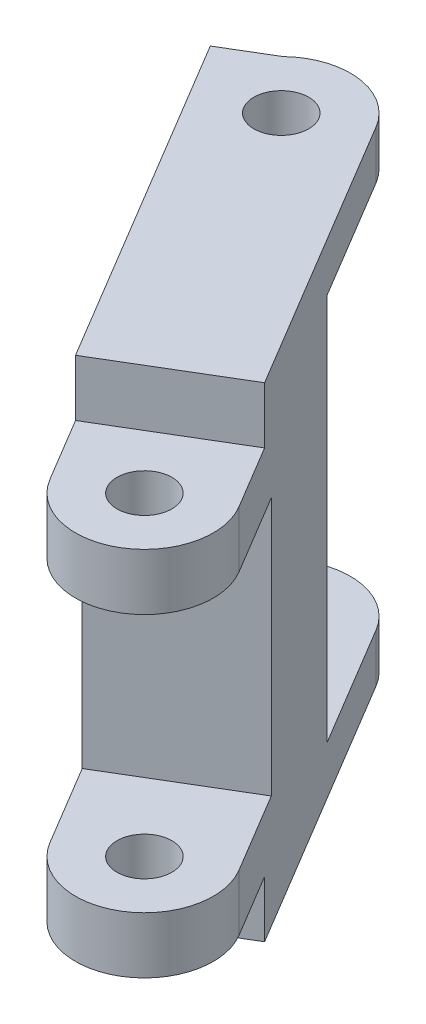
ISO-10303-21;
HEADER;
FILE_DESCRIPTION(('STEP AP214'),'2;1');
FILE_NAME('part.step','',(''),(''),'','','');
FILE_SCHEMA(('AUTOMOTIVE_DESIGN { 1 0 10303 214 1 1 1 1 }'));
ENDSEC;
DATA;
#1=APPLICATION_CONTEXT('core data for automotive mechanical design processes');
#2=APPLICATION_PROTOCOL_DEFINITION('international standard','automotive_design',2000,#1);
#3=PRODUCT_CONTEXT('',#1,'mechanical');
#4=PRODUCT('Part','Part','',(#3));
#5=PRODUCT_RELATED_PRODUCT_CATEGORY('part','',(#4));
#6=PRODUCT_DEFINITION_FORMATION('','',#4);
#7=PRODUCT_DEFINITION_CONTEXT('part definition',#1,'design');
#8=PRODUCT_DEFINITION('design','',#6,#7);
#9=PRODUCT_DEFINITION_SHAPE('','',#8);
#10=(LENGTH_UNIT() NAMED_UNIT(*) SI_UNIT(.MILLI.,.METRE.));
#11=(NAMED_UNIT(*) PLANE_ANGLE_UNIT() SI_UNIT($,.RADIAN.));
#12=(NAMED_UNIT(*) SI_UNIT($,.STERADIAN.) SOLID_ANGLE_UNIT());
#13=UNCERTAINTY_MEASURE_WITH_UNIT(LENGTH_MEASURE(1.E-05),#10,'distance_accuracy_value','');
#14=(GEOMETRIC_REPRESENTATION_CONTEXT(3) GLOBAL_UNCERTAINTY_ASSIGNED_CONTEXT((#13)) GLOBAL_UNIT_ASSIGNED_CONTEXT((#10,
#11,#12)) REPRESENTATION_CONTEXT('',''));
#15=CARTESIAN_POINT('',(0.,0.,0.));
#16=DIRECTION('',(0.,0.,1.));
#17=DIRECTION('',(1.,0.,0.));
#18=AXIS2_PLACEMENT_3D('',#15,#16,#17);
#19=CARTESIAN_POINT('',(-3.11840054835048,30.,-44.5812672091987));
#20=DIRECTION('',(0.,-1.,0.));
#21=DIRECTION('',(0.,0.,-1.));
#22=AXIS2_PLACEMENT_3D('',#19,#20,#21);
#23=CYLINDRICAL_SURFACE('',#22,1.7);
#24=CARTESIAN_POINT('',(-3.11840054835048,26.5,-44.5812672091987));
#25=DIRECTION('',(0.,-1.,0.));
#26=DIRECTION('',(0.,0.,-1.));
#27=AXIS2_PLACEMENT_3D('',#24,#25,#26);
#28=CIRCLE('',#27,1.7);
#29=CARTESIAN_POINT('',(-3.11840054835048,26.5,-46.2812672091987));
#30=VERTEX_POINT('',#29);
#31=EDGE_CURVE('E192',#30,#30,#28,.T.);
#32=ORIENTED_EDGE('',*,*,#31,.F.);
#33=EDGE_LOOP('',(#32));
#34=FACE_BOUND('',#33,.T.);
#35=CARTESIAN_POINT('',(-3.11840054835048,23.,-44.5812672091987));
#36=DIRECTION('',(0.,1.,0.));
#37=DIRECTION('',(0.,0.,1.));
#38=AXIS2_PLACEMENT_3D('',#35,#36,#37);
#39=CIRCLE('',#38,1.7);
#40=CARTESIAN_POINT('',(-3.11840054835048,23.,-42.8812672091987));
#41=VERTEX_POINT('',#40);
#42=EDGE_CURVE('E232',#41,#41,#39,.T.);
#43=ORIENTED_EDGE('',*,*,#42,.F.);
#44=EDGE_LOOP('',(#43));
#45=FACE_BOUND('',#44,.T.);
#46=ADVANCED_FACE('F43',(#34,#45),#23,.F.);
#47=CARTESIAN_POINT('',(-3.11840054835048,30.,-44.5812672091987));
#48=DIRECTION('',(0.,-1.,0.));
#49=DIRECTION('',(0.,0.,-1.));
#50=AXIS2_PLACEMENT_3D('',#47,#48,#49);
#51=CYLINDRICAL_SURFACE('',#50,4.27118158012899);
#52=DIRECTION('',(0.,-1.,0.));
#53=VECTOR('',#52,1.);
#54=CARTESIAN_POINT('',(0.547347337405798,30.,-46.7733631305731));
#55=LINE('',#54,#53);
#56=CARTESIAN_POINT('',(0.547347337405801,26.5,-46.7733631305731));
#57=VERTEX_POINT('',#56);
#58=CARTESIAN_POINT('',(0.547347337405799,23.,-46.7733631305731));
#59=VERTEX_POINT('',#58);
#60=EDGE_CURVE('E297',#57,#59,#55,.T.);
#61=ORIENTED_EDGE('',*,*,#60,.F.);
#62=CARTESIAN_POINT('',(-3.11840054835048,26.5,-44.5812672091987));
#63=DIRECTION('',(0.,-1.,0.));
#64=DIRECTION('',(0.,0.,-1.));
#65=AXIS2_PLACEMENT_3D('',#62,#63,#64);
#66=CIRCLE('',#65,4.27118158012899);
#67=CARTESIAN_POINT('',(-6.78414843410676,26.5,-42.3891712878242));
#68=VERTEX_POINT('',#67);
#69=EDGE_CURVE('E190',#57,#68,#66,.T.);
#70=ORIENTED_EDGE('',*,*,#69,.T.);
#71=DIRECTION('',(0.,-1.,0.));
#72=VECTOR('',#71,1.);
#73=CARTESIAN_POINT('',(-6.78414843410676,30.,-42.3891712878242));
#74=LINE('',#73,#72);
#75=CARTESIAN_POINT('',(-6.78414843410676,23.,-42.3891712878242));
#76=VERTEX_POINT('',#75);
#77=EDGE_CURVE('E185',#68,#76,#74,.T.);
#78=ORIENTED_EDGE('',*,*,#77,.T.);
#79=CARTESIAN_POINT('',(-3.11840054835048,23.,-44.5812672091987));
#80=DIRECTION('',(0.,1.,0.));
#81=DIRECTION('',(0.,0.,1.));
#82=AXIS2_PLACEMENT_3D('',#79,#80,#81);
#83=CIRCLE('',#82,4.27118158012899);
#84=EDGE_CURVE('E320',#76,#59,#83,.T.);
#85=ORIENTED_EDGE('',*,*,#84,.T.);
#86=EDGE_LOOP('',(#61,#70,#78,#85));
#87=FACE_BOUND('',#86,.T.);
#88=ADVANCED_FACE('F405',(#87),#51,.T.);
#89=CARTESIAN_POINT('',(-15.7737708009403,30.,-65.7176303802829));
#90=DIRECTION('',(0.,-1.,0.));
#91=DIRECTION('',(0.,0.,-1.));
#92=AXIS2_PLACEMENT_3D('',#89,#90,#91);
#93=CYLINDRICAL_SURFACE('',#92,4.2848689511232);
#94=CARTESIAN_POINT('',(-15.7737708009403,27.,-65.7176303802829));
#95=DIRECTION('',(0.,-1.,0.));
#96=DIRECTION('',(0.,0.,-1.));
#97=AXIS2_PLACEMENT_3D('',#94,#95,#96);
#98=CIRCLE('',#97,4.2848689511232);
#99=CARTESIAN_POINT('',(-18.7462358249816,27.,-68.8038179327739));
#100=VERTEX_POINT('',#99);
#101=CARTESIAN_POINT('',(-12.0962757088566,27.,-67.9167510627376));
#102=VERTEX_POINT('',#101);
#103=EDGE_CURVE('E255',#100,#102,#98,.T.);
#104=ORIENTED_EDGE('',*,*,#103,.F.);
#105=DIRECTION('',(0.,-1.,0.));
#106=VECTOR('',#105,1.);
#107=CARTESIAN_POINT('',(-18.7462358249816,30.,-68.8038179327739));
#108=LINE('',#107,#106);
#109=CARTESIAN_POINT('',(-18.7462358249816,30.,-68.8038179327739));
#110=VERTEX_POINT('',#109);
#111=EDGE_CURVE('E306',#110,#100,#108,.T.);
#112=ORIENTED_EDGE('',*,*,#111,.F.);
#113=CARTESIAN_POINT('',(-15.7737708009403,30.,-65.7176303802829));
#114=DIRECTION('',(0.,1.,0.));
#115=DIRECTION('',(0.,0.,1.));
#116=AXIS2_PLACEMENT_3D('',#113,#114,#115);
#117=CIRCLE('',#116,4.2848689511232);
#118=CARTESIAN_POINT('',(-12.0962757088566,30.,-67.9167510627376));
#119=VERTEX_POINT('',#118);
#120=EDGE_CURVE('E278',#119,#110,#117,.T.);
#121=ORIENTED_EDGE('',*,*,#120,.F.);
#122=DIRECTION('',(0.,-1.,0.));
#123=VECTOR('',#122,1.);
#124=CARTESIAN_POINT('',(-12.0962757088566,30.,-67.9167510627376));
#125=LINE('',#124,#123);
#126=EDGE_CURVE('E310',#119,#102,#125,.T.);
#127=ORIENTED_EDGE('',*,*,#126,.T.);
#128=EDGE_LOOP('',(#104,#112,#121,#127));
#129=FACE_BOUND('',#128,.T.);
#130=ADVANCED_FACE('F377',(#129),#93,.T.);
#131=CARTESIAN_POINT('',(-35.2445386971406,30.,-58.9379287437799));
#132=DIRECTION('',(-0.513229391036159,0.,-0.858251473739867));
#133=DIRECTION('',(-0.858251473739867,0.,0.513229391036159));
#134=AXIS2_PLACEMENT_3D('',#131,#132,#133);
#135=PLANE('',#134);
#136=ORIENTED_EDGE('',*,*,#111,.T.);
#137=DIRECTION('',(-0.858251473739867,0.,0.513229391036159));
#138=VECTOR('',#137,1.);
#139=CARTESIAN_POINT('',(-35.2445386971406,27.,-58.9379287437799));
#140=LINE('',#139,#138);
#141=CARTESIAN_POINT('',(-21.5701353963567,27.,-67.1151424085145));
#142=VERTEX_POINT('',#141);
#143=EDGE_CURVE('E252',#100,#142,#140,.T.);
#144=ORIENTED_EDGE('',*,*,#143,.T.);
#145=DIRECTION('',(0.,-1.,0.));
#146=VECTOR('',#145,1.);
#147=CARTESIAN_POINT('',(-21.5701353963567,30.,-67.1151424085144));
#148=LINE('',#147,#146);
#149=CARTESIAN_POINT('',(-21.5701353963567,30.,-67.1151424085144));
#150=VERTEX_POINT('',#149);
#151=EDGE_CURVE('E302',#150,#142,#148,.T.);
#152=ORIENTED_EDGE('',*,*,#151,.F.);
#153=DIRECTION('',(0.858251473739867,0.,-0.513229391036159));
#154=VECTOR('',#153,1.);
#155=CARTESIAN_POINT('',(-35.2445386971406,30.,-58.9379287437799));
#156=LINE('',#155,#154);
#157=EDGE_CURVE('E280',#150,#110,#156,.T.);
#158=ORIENTED_EDGE('',*,*,#157,.T.);
#159=EDGE_LOOP('',(#136,#144,#152,#158));
#160=FACE_BOUND('',#159,.T.);
#161=ADVANCED_FACE('F372',(#160),#135,.T.);
#162=CARTESIAN_POINT('',(-15.7737708009403,30.,-65.7176303802829));
#163=DIRECTION('',(0.,-1.,0.));
#164=DIRECTION('',(0.,0.,-1.));
#165=AXIS2_PLACEMENT_3D('',#162,#163,#164);
#166=CYLINDRICAL_SURFACE('',#165,1.7);
#167=CARTESIAN_POINT('',(-15.7737708009403,30.,-65.7176303802829));
#168=DIRECTION('',(0.,1.,0.));
#169=DIRECTION('',(0.,0.,1.));
#170=AXIS2_PLACEMENT_3D('',#167,#168,#169);
#171=CIRCLE('',#170,1.7);
#172=CARTESIAN_POINT('',(-15.7737708009403,30.,-64.0176303802829));
#173=VERTEX_POINT('',#172);
#174=EDGE_CURVE('E272',#173,#173,#171,.T.);
#175=ORIENTED_EDGE('',*,*,#174,.T.);
#176=EDGE_LOOP('',(#175));
#177=FACE_BOUND('',#176,.T.);
#178=CARTESIAN_POINT('',(-15.7737708009403,27.,-65.7176303802829));
#179=DIRECTION('',(0.,-1.,0.));
#180=DIRECTION('',(0.,0.,-1.));
#181=AXIS2_PLACEMENT_3D('',#178,#179,#180);
#182=CIRCLE('',#181,1.7);
#183=CARTESIAN_POINT('',(-15.7737708009403,27.,-67.4176303802829));
#184=VERTEX_POINT('',#183);
#185=EDGE_CURVE('E249',#184,#184,#182,.T.);
#186=ORIENTED_EDGE('',*,*,#185,.T.);
#187=EDGE_LOOP('',(#186));
#188=FACE_BOUND('',#187,.T.);
#189=ADVANCED_FACE('F387',(#177,#188),#166,.F.);
#190=CARTESIAN_POINT('',(21.0058990722965,30.,-12.5614055074834));
#191=DIRECTION('',(-0.858251473739867,0.,0.513229391036159));
#192=DIRECTION('',(0.513229391036159,0.,0.858251473739867));
#193=AXIS2_PLACEMENT_3D('',#190,#191,#192);
#194=PLANE('',#193);
#195=DIRECTION('',(0.,-1.,0.));
#196=VECTOR('',#195,1.);
#197=CARTESIAN_POINT('',(-1.81775136478792,30.,-50.7284161383519));
#198=LINE('',#197,#196);
#199=CARTESIAN_POINT('',(-1.81775136478792,30.,-50.7284161383519));
#200=VERTEX_POINT('',#199);
#201=CARTESIAN_POINT('',(-1.81775136478792,26.5,-50.7284161383519));
#202=VERTEX_POINT('',#201);
#203=EDGE_CURVE('E57',#200,#202,#198,.T.);
#204=ORIENTED_EDGE('',*,*,#203,.T.);
#205=DIRECTION('',(0.513229391036159,0.,0.858251473739867));
#206=VECTOR('',#205,1.);
#207=CARTESIAN_POINT('',(21.0058990722965,26.5,-12.5614055074834));
#208=LINE('',#207,#206);
#209=EDGE_CURVE('E174',#202,#57,#208,.T.);
#210=ORIENTED_EDGE('',*,*,#209,.T.);
#211=ORIENTED_EDGE('',*,*,#60,.T.);
#212=DIRECTION('',(-0.513229391036159,0.,-0.858251473739867));
#213=VECTOR('',#212,1.);
#214=CARTESIAN_POINT('',(21.0058990722965,23.,-12.5614055074834));
#215=LINE('',#214,#213);
#216=CARTESIAN_POINT('',(-2.43436363101253,23.,-51.7595503552464));
#217=VERTEX_POINT('',#216);
#218=EDGE_CURVE('E229',#59,#217,#215,.T.);
#219=ORIENTED_EDGE('',*,*,#218,.T.);
#220=DIRECTION('',(0.,-1.,0.));
#221=VECTOR('',#220,1.);
#222=CARTESIAN_POINT('',(-2.43436363101253,30.,-51.7595503552464));
#223=LINE('',#222,#221);
#224=CARTESIAN_POINT('',(-2.43436363101253,7.,-51.7595503552464));
#225=VERTEX_POINT('',#224);
#226=EDGE_CURVE('E235',#217,#225,#223,.T.);
#227=ORIENTED_EDGE('',*,*,#226,.T.);
#228=DIRECTION('',(0.513229391036159,0.,0.858251473739867));
#229=VECTOR('',#228,1.);
#230=CARTESIAN_POINT('',(21.0058990722965,7.,-12.5614055074834));
#231=LINE('',#230,#229);
#232=CARTESIAN_POINT('',(0.547347337405799,7.,-46.7733631305731));
#233=VERTEX_POINT('',#232);
#234=EDGE_CURVE('E222',#225,#233,#231,.T.);
#235=ORIENTED_EDGE('',*,*,#234,.T.);
#236=CARTESIAN_POINT('',(0.547347337405794,3.5,-46.7733631305731));
#237=VERTEX_POINT('',#236);
#238=EDGE_CURVE('E285',#233,#237,#55,.T.);
#239=ORIENTED_EDGE('',*,*,#238,.T.);
#240=DIRECTION('',(0.513229391036158,0.,0.858251473739867));
#241=VECTOR('',#240,1.);
#242=CARTESIAN_POINT('',(3.39102063143032,3.5,-42.0180103817682));
#243=LINE('',#242,#241);
#244=CARTESIAN_POINT('',(-1.81775136478791,3.5,-50.7284161383518));
#245=VERTEX_POINT('',#244);
#246=EDGE_CURVE('E196',#245,#237,#243,.T.);
#247=ORIENTED_EDGE('',*,*,#246,.F.);
#248=DIRECTION('',(0.,-1.,0.));
#249=VECTOR('',#248,1.);
#250=CARTESIAN_POINT('',(-1.81775136478791,3.5,-50.7284161383518));
#251=LINE('',#250,#249);
#252=CARTESIAN_POINT('',(-1.81775136478791,0.,-50.7284161383518));
#253=VERTEX_POINT('',#252);
#254=EDGE_CURVE('E204',#245,#253,#251,.T.);
#255=ORIENTED_EDGE('',*,*,#254,.T.);
#256=DIRECTION('',(-0.513229391036159,0.,-0.858251473739867));
#257=VECTOR('',#256,1.);
#258=CARTESIAN_POINT('',(21.0058990722965,0.,-12.5614055074834));
#259=LINE('',#258,#257);
#260=CARTESIAN_POINT('',(-12.0962757088566,0.,-67.9167510627376));
#261=VERTEX_POINT('',#260);
#262=EDGE_CURVE('E288',#253,#261,#259,.T.);
#263=ORIENTED_EDGE('',*,*,#262,.T.);
#264=CARTESIAN_POINT('',(-12.0962757088566,3.,-67.9167510627376));
#265=VERTEX_POINT('',#264);
#266=EDGE_CURVE('E309',#265,#261,#125,.T.);
#267=ORIENTED_EDGE('',*,*,#266,.F.);
#268=DIRECTION('',(0.513229391036159,0.,0.858251473739867));
#269=VECTOR('',#268,1.);
#270=CARTESIAN_POINT('',(21.0058990722965,3.,-12.5614055074834));
#271=LINE('',#270,#269);
#272=CARTESIAN_POINT('',(-7.5666575413741,3.,-60.3420650926451));
#273=VERTEX_POINT('',#272);
#274=EDGE_CURVE('E265',#265,#273,#271,.T.);
#275=ORIENTED_EDGE('',*,*,#274,.T.);
#276=DIRECTION('',(0.,1.,0.));
#277=VECTOR('',#276,1.);
#278=CARTESIAN_POINT('',(-7.56665754137411,30.,-60.3420650926451));
#279=LINE('',#278,#277);
#280=CARTESIAN_POINT('',(-7.5666575413741,27.,-60.3420650926451));
#281=VERTEX_POINT('',#280);
#282=EDGE_CURVE('E268',#273,#281,#279,.T.);
#283=ORIENTED_EDGE('',*,*,#282,.T.);
#284=DIRECTION('',(0.513229391036159,0.,0.858251473739867));
#285=VECTOR('',#284,1.);
#286=CARTESIAN_POINT('',(21.0058990722965,27.,-12.5614055074834));
#287=LINE('',#286,#285);
#288=EDGE_CURVE('E257',#102,#281,#287,.T.);
#289=ORIENTED_EDGE('',*,*,#288,.F.);
#290=ORIENTED_EDGE('',*,*,#126,.F.);
#291=DIRECTION('',(-0.513229391036159,0.,-0.858251473739867));
#292=VECTOR('',#291,1.);
#293=CARTESIAN_POINT('',(21.0058990722965,30.,-12.5614055074834));
#294=LINE('',#293,#292);
#295=EDGE_CURVE('E275',#200,#119,#294,.T.);
#296=ORIENTED_EDGE('',*,*,#295,.F.);
#297=EDGE_LOOP('',(#204,#210,#211,#219,#227,#235,#239,#247,#255,#263,#267,#275,#283,#289,#290,#296));
#298=FACE_BOUND('',#297,.T.);
#299=ADVANCED_FACE('F333',(#298),#194,.F.);
#300=CARTESIAN_POINT('',(-18.7462358249816,3.,-68.8038179327739));
#301=VERTEX_POINT('',#300);
#302=CARTESIAN_POINT('',(-18.7462358249816,0.,-68.8038179327739));
#303=VERTEX_POINT('',#302);
#304=EDGE_CURVE('E305',#301,#303,#108,.T.);
#305=ORIENTED_EDGE('',*,*,#304,.F.);
#306=CARTESIAN_POINT('',(-15.7737708009403,3.,-65.7176303802829));
#307=DIRECTION('',(0.,-1.,0.));
#308=DIRECTION('',(0.,0.,-1.));
#309=AXIS2_PLACEMENT_3D('',#306,#307,#308);
#310=CIRCLE('',#309,4.2848689511232);
#311=EDGE_CURVE('E262',#301,#265,#310,.T.);
#312=ORIENTED_EDGE('',*,*,#311,.T.);
#313=ORIENTED_EDGE('',*,*,#266,.T.);
#314=CARTESIAN_POINT('',(-15.7737708009403,0.,-65.7176303802829));
#315=DIRECTION('',(0.,1.,0.));
#316=DIRECTION('',(0.,0.,1.));
#317=AXIS2_PLACEMENT_3D('',#314,#315,#316);
#318=CIRCLE('',#317,4.2848689511232);
#319=EDGE_CURVE('E290',#261,#303,#318,.T.);
#320=ORIENTED_EDGE('',*,*,#319,.T.);
#321=EDGE_LOOP('',(#305,#312,#313,#320));
#322=FACE_BOUND('',#321,.T.);
#323=ADVANCED_FACE('F354',(#322),#93,.T.);
#324=DIRECTION('',(-0.858251473739867,0.,0.513229391036159));
#325=VECTOR('',#324,1.);
#326=CARTESIAN_POINT('',(-35.2445386971406,3.,-58.9379287437799));
#327=LINE('',#326,#325);
#328=CARTESIAN_POINT('',(-21.5701353963567,3.,-67.1151424085145));
#329=VERTEX_POINT('',#328);
#330=EDGE_CURVE('E260',#301,#329,#327,.T.);
#331=ORIENTED_EDGE('',*,*,#330,.F.);
#332=ORIENTED_EDGE('',*,*,#304,.T.);
#333=DIRECTION('',(0.858251473739867,0.,-0.513229391036159));
#334=VECTOR('',#333,1.);
#335=CARTESIAN_POINT('',(-35.2445386971406,0.,-58.9379287437799));
#336=LINE('',#335,#334);
#337=CARTESIAN_POINT('',(-21.5701353963567,0.,-67.1151424085144));
#338=VERTEX_POINT('',#337);
#339=EDGE_CURVE('E293',#338,#303,#336,.T.);
#340=ORIENTED_EDGE('',*,*,#339,.F.);
#341=EDGE_CURVE('E301',#329,#338,#148,.T.);
#342=ORIENTED_EDGE('',*,*,#341,.F.);
#343=EDGE_LOOP('',(#331,#332,#340,#342));
#344=FACE_BOUND('',#343,.T.);
#345=ADVANCED_FACE('F527',(#344),#135,.T.);
#346=CARTESIAN_POINT('',(13.6744033007839,30.,-8.17721366473448));
#347=DIRECTION('',(-0.858251473739867,0.,0.513229391036159));
#348=DIRECTION('',(0.513229391036159,0.,0.858251473739867));
#349=AXIS2_PLACEMENT_3D('',#346,#347,#348);
#350=PLANE('',#349);
#351=DIRECTION('',(0.513229391036159,0.,0.858251473739867));
#352=VECTOR('',#351,1.);
#353=CARTESIAN_POINT('',(-9.14924713630047,26.5,-46.3442242956029));
#354=LINE('',#353,#352);
#355=CARTESIAN_POINT('',(-9.14924713630047,26.5,-46.3442242956029));
#356=VERTEX_POINT('',#355);
#357=EDGE_CURVE('E171',#356,#68,#354,.T.);
#358=ORIENTED_EDGE('',*,*,#357,.F.);
#359=DIRECTION('',(0.,-1.,0.));
#360=VECTOR('',#359,1.);
#361=CARTESIAN_POINT('',(-9.14924713630047,30.,-46.3442242956029));
#362=LINE('',#361,#360);
#363=CARTESIAN_POINT('',(-9.14924713630047,30.,-46.3442242956029));
#364=VERTEX_POINT('',#363);
#365=EDGE_CURVE('E177',#364,#356,#362,.T.);
#366=ORIENTED_EDGE('',*,*,#365,.F.);
#367=DIRECTION('',(-0.513229391036159,0.,-0.858251473739867));
#368=VECTOR('',#367,1.);
#369=CARTESIAN_POINT('',(13.6744033007839,30.,-8.17721366473448));
#370=LINE('',#369,#368);
#371=EDGE_CURVE('E283',#364,#150,#370,.T.);
#372=ORIENTED_EDGE('',*,*,#371,.T.);
#373=ORIENTED_EDGE('',*,*,#151,.T.);
#374=DIRECTION('',(0.513229391036159,0.,0.858251473739867));
#375=VECTOR('',#374,1.);
#376=CARTESIAN_POINT('',(13.6744033007839,27.,-8.17721366473448));
#377=LINE('',#376,#375);
#378=CARTESIAN_POINT('',(-14.8981533128867,27.,-55.9578732498962));
#379=VERTEX_POINT('',#378);
#380=EDGE_CURVE('E243',#142,#379,#377,.T.);
#381=ORIENTED_EDGE('',*,*,#380,.T.);
#382=DIRECTION('',(0.,1.,0.));
#383=VECTOR('',#382,1.);
#384=CARTESIAN_POINT('',(-14.8981533128867,0.,-55.9578732498962));
#385=LINE('',#384,#383);
#386=CARTESIAN_POINT('',(-14.8981533128867,3.,-55.9578732498962));
#387=VERTEX_POINT('',#386);
#388=EDGE_CURVE('E240',#387,#379,#385,.T.);
#389=ORIENTED_EDGE('',*,*,#388,.F.);
#390=DIRECTION('',(0.513229391036159,0.,0.858251473739867));
#391=VECTOR('',#390,1.);
#392=CARTESIAN_POINT('',(13.6744033007839,3.,-8.17721366473448));
#393=LINE('',#392,#391);
#394=EDGE_CURVE('E238',#329,#387,#393,.T.);
#395=ORIENTED_EDGE('',*,*,#394,.F.);
#396=ORIENTED_EDGE('',*,*,#341,.T.);
#397=DIRECTION('',(-0.513229391036159,0.,-0.858251473739867));
#398=VECTOR('',#397,1.);
#399=CARTESIAN_POINT('',(13.6744033007839,0.,-8.17721366473448));
#400=LINE('',#399,#398);
#401=CARTESIAN_POINT('',(-9.14924713630048,0.,-46.3442242956029));
#402=VERTEX_POINT('',#401);
#403=EDGE_CURVE('E276',#402,#338,#400,.T.);
#404=ORIENTED_EDGE('',*,*,#403,.F.);
#405=DIRECTION('',(0.,-1.,0.));
#406=VECTOR('',#405,1.);
#407=CARTESIAN_POINT('',(-9.14924713630047,3.5,-46.3442242956029));
#408=LINE('',#407,#406);
#409=CARTESIAN_POINT('',(-9.14924713630047,3.5,-46.3442242956029));
#410=VERTEX_POINT('',#409);
#411=EDGE_CURVE('E65',#410,#402,#408,.T.);
#412=ORIENTED_EDGE('',*,*,#411,.F.);
#413=DIRECTION('',(-0.513229391036158,0.,-0.858251473739867));
#414=VECTOR('',#413,1.);
#415=CARTESIAN_POINT('',(-9.14924713630047,3.5,-46.3442242956029));
#416=LINE('',#415,#414);
#417=CARTESIAN_POINT('',(-6.78414843410676,3.5,-42.3891712878242));
#418=VERTEX_POINT('',#417);
#419=EDGE_CURVE('E198',#418,#410,#416,.T.);
#420=ORIENTED_EDGE('',*,*,#419,.F.);
#421=CARTESIAN_POINT('',(-6.78414843410676,7.,-42.3891712878242));
#422=VERTEX_POINT('',#421);
#423=EDGE_CURVE('E299',#422,#418,#74,.T.);
#424=ORIENTED_EDGE('',*,*,#423,.F.);
#425=DIRECTION('',(0.513229391036158,0.,0.858251473739867));
#426=VECTOR('',#425,1.);
#427=CARTESIAN_POINT('',(-9.76585940252509,7.,-47.3753585124975));
#428=LINE('',#427,#426);
#429=CARTESIAN_POINT('',(-9.76585940252509,7.,-47.3753585124975));
#430=VERTEX_POINT('',#429);
#431=EDGE_CURVE('E214',#430,#422,#428,.T.);
#432=ORIENTED_EDGE('',*,*,#431,.F.);
#433=DIRECTION('',(0.,-1.,0.));
#434=VECTOR('',#433,1.);
#435=CARTESIAN_POINT('',(-9.76585940252509,7.,-47.3753585124975));
#436=LINE('',#435,#434);
#437=CARTESIAN_POINT('',(-9.76585940252509,23.,-47.3753585124975));
#438=VERTEX_POINT('',#437);
#439=EDGE_CURVE('E211',#438,#430,#436,.T.);
#440=ORIENTED_EDGE('',*,*,#439,.F.);
#441=DIRECTION('',(-0.513229391036158,0.,-0.858251473739867));
#442=VECTOR('',#441,1.);
#443=CARTESIAN_POINT('',(-9.76585940252509,23.,-47.3753585124975));
#444=LINE('',#443,#442);
#445=EDGE_CURVE('E216',#76,#438,#444,.T.);
#446=ORIENTED_EDGE('',*,*,#445,.F.);
#447=ORIENTED_EDGE('',*,*,#77,.F.);
#448=EDGE_LOOP('',(#358,#366,#372,#373,#381,#389,#395,#396,#404,#412,#420,#424,#432,#440,#446,#447));
#449=FACE_BOUND('',#448,.T.);
#450=ADVANCED_FACE('F183',(#449),#350,.T.);
#451=CARTESIAN_POINT('',(-15.7737708009403,3.,-65.7176303802829));
#452=DIRECTION('',(0.,-1.,0.));
#453=DIRECTION('',(0.,0.,-1.));
#454=AXIS2_PLACEMENT_3D('',#451,#452,#453);
#455=CIRCLE('',#454,1.7);
#456=CARTESIAN_POINT('',(-15.7737708009403,3.,-67.4176303802829));
#457=VERTEX_POINT('',#456);
#458=EDGE_CURVE('E259',#457,#457,#455,.T.);
#459=ORIENTED_EDGE('',*,*,#458,.F.);
#460=EDGE_LOOP('',(#459));
#461=FACE_BOUND('',#460,.T.);
#462=CARTESIAN_POINT('',(-15.7737708009403,0.,-65.7176303802829));
#463=DIRECTION('',(0.,1.,0.));
#464=DIRECTION('',(0.,0.,1.));
#465=AXIS2_PLACEMENT_3D('',#462,#463,#464);
#466=CIRCLE('',#465,1.7);
#467=CARTESIAN_POINT('',(-15.7737708009403,0.,-64.0176303802829));
#468=VERTEX_POINT('',#467);
#469=EDGE_CURVE('E271',#468,#468,#466,.T.);
#470=ORIENTED_EDGE('',*,*,#469,.F.);
#471=EDGE_LOOP('',(#470));
#472=FACE_BOUND('',#471,.T.);
#473=ADVANCED_FACE('F390',(#461,#472),#166,.F.);
#474=CARTESIAN_POINT('',(-3.11840054835048,3.5,-44.5812672091987));
#475=DIRECTION('',(0.,1.,0.));
#476=DIRECTION('',(0.,0.,1.));
#477=AXIS2_PLACEMENT_3D('',#474,#475,#476);
#478=CIRCLE('',#477,1.7);
#479=CARTESIAN_POINT('',(-3.11840054835048,3.5,-42.8812672091987));
#480=VERTEX_POINT('',#479);
#481=EDGE_CURVE('E207',#480,#480,#478,.T.);
#482=ORIENTED_EDGE('',*,*,#481,.F.);
#483=EDGE_LOOP('',(#482));
#484=FACE_BOUND('',#483,.T.);
#485=CARTESIAN_POINT('',(-3.11840054835048,7.,-44.5812672091987));
#486=DIRECTION('',(0.,-1.,0.));
#487=DIRECTION('',(0.,0.,-1.));
#488=AXIS2_PLACEMENT_3D('',#485,#486,#487);
#489=CIRCLE('',#488,1.7);
#490=CARTESIAN_POINT('',(-3.11840054835048,7.,-46.2812672091987));
#491=VERTEX_POINT('',#490);
#492=EDGE_CURVE('E226',#491,#491,#489,.T.);
#493=ORIENTED_EDGE('',*,*,#492,.F.);
#494=EDGE_LOOP('',(#493));
#495=FACE_BOUND('',#494,.T.);
#496=ADVANCED_FACE('F45',(#484,#495),#23,.F.);
#497=ORIENTED_EDGE('',*,*,#423,.T.);
#498=CARTESIAN_POINT('',(-3.11840054835048,3.5,-44.5812672091987));
#499=DIRECTION('',(0.,1.,0.));
#500=DIRECTION('',(0.,0.,1.));
#501=AXIS2_PLACEMENT_3D('',#498,#499,#500);
#502=CIRCLE('',#501,4.27118158012899);
#503=EDGE_CURVE('E51',#418,#237,#502,.T.);
#504=ORIENTED_EDGE('',*,*,#503,.T.);
#505=ORIENTED_EDGE('',*,*,#238,.F.);
#506=CARTESIAN_POINT('',(-3.11840054835048,7.,-44.5812672091987));
#507=DIRECTION('',(0.,-1.,0.));
#508=DIRECTION('',(0.,0.,-1.));
#509=AXIS2_PLACEMENT_3D('',#506,#507,#508);
#510=CIRCLE('',#509,4.27118158012899);
#511=EDGE_CURVE('E313',#233,#422,#510,.T.);
#512=ORIENTED_EDGE('',*,*,#511,.T.);
#513=EDGE_LOOP('',(#497,#504,#505,#512));
#514=FACE_BOUND('',#513,.T.);
#515=ADVANCED_FACE('F327',(#514),#51,.T.);
#516=CARTESIAN_POINT('',(0.,30.,0.));
#517=DIRECTION('',(0.,1.,0.));
#518=DIRECTION('',(0.,0.,1.));
#519=AXIS2_PLACEMENT_3D('',#516,#517,#518);
#520=PLANE('',#519);
#521=DIRECTION('',(-0.858251473739867,0.,0.513229391036159));
#522=VECTOR('',#521,1.);
#523=CARTESIAN_POINT('',(-22.8236504370844,30.,-38.1670106308685));
#524=LINE('',#523,#522);
#525=EDGE_CURVE('E11',#200,#364,#524,.T.);
#526=ORIENTED_EDGE('',*,*,#525,.F.);
#527=ORIENTED_EDGE('',*,*,#295,.T.);
#528=ORIENTED_EDGE('',*,*,#120,.T.);
#529=ORIENTED_EDGE('',*,*,#157,.F.);
#530=ORIENTED_EDGE('',*,*,#371,.F.);
#531=EDGE_LOOP('',(#526,#527,#528,#529,#530));
#532=FACE_BOUND('',#531,.T.);
#533=ORIENTED_EDGE('',*,*,#174,.F.);
#534=EDGE_LOOP('',(#533));
#535=FACE_BOUND('',#534,.T.);
#536=ADVANCED_FACE('F381',(#532,#535),#520,.T.);
#537=CARTESIAN_POINT('',(0.,0.,0.));
#538=DIRECTION('',(0.,1.,0.));
#539=DIRECTION('',(0.,0.,1.));
#540=AXIS2_PLACEMENT_3D('',#537,#538,#539);
#541=PLANE('',#540);
#542=ORIENTED_EDGE('',*,*,#469,.T.);
#543=EDGE_LOOP('',(#542));
#544=FACE_BOUND('',#543,.T.);
#545=ORIENTED_EDGE('',*,*,#262,.F.);
#546=DIRECTION('',(0.858251473739867,0.,-0.513229391036158));
#547=VECTOR('',#546,1.);
#548=CARTESIAN_POINT('',(-1.81775136478791,0.,-50.7284161383518));
#549=LINE('',#548,#547);
#550=EDGE_CURVE('E195',#402,#253,#549,.T.);
#551=ORIENTED_EDGE('',*,*,#550,.F.);
#552=ORIENTED_EDGE('',*,*,#403,.T.);
#553=ORIENTED_EDGE('',*,*,#339,.T.);
#554=ORIENTED_EDGE('',*,*,#319,.F.);
#555=EDGE_LOOP('',(#545,#551,#552,#553,#554));
#556=FACE_BOUND('',#555,.T.);
#557=ADVANCED_FACE('F350',(#544,#556),#541,.F.);
#558=CARTESIAN_POINT('',(10.8493908993094,0.,-71.3547549809809));
#559=DIRECTION('',(0.513229391036158,0.,0.858251473739867));
#560=DIRECTION('',(0.858251473739867,0.,-0.513229391036159));
#561=AXIS2_PLACEMENT_3D('',#558,#559,#560);
#562=PLANE('',#561);
#563=DIRECTION('',(-0.858251473739867,0.,0.513229391036158));
#564=VECTOR('',#563,1.);
#565=CARTESIAN_POINT('',(10.8493908993094,3.,-71.3547549809809));
#566=LINE('',#565,#564);
#567=EDGE_CURVE('E246',#273,#387,#566,.T.);
#568=ORIENTED_EDGE('',*,*,#567,.T.);
#569=ORIENTED_EDGE('',*,*,#388,.T.);
#570=DIRECTION('',(-0.858251473739867,0.,0.513229391036158));
#571=VECTOR('',#570,1.);
#572=CARTESIAN_POINT('',(10.8493908993094,27.,-71.3547549809809));
#573=LINE('',#572,#571);
#574=EDGE_CURVE('E247',#281,#379,#573,.T.);
#575=ORIENTED_EDGE('',*,*,#574,.F.);
#576=ORIENTED_EDGE('',*,*,#282,.F.);
#577=EDGE_LOOP('',(#568,#569,#575,#576));
#578=FACE_BOUND('',#577,.T.);
#579=ADVANCED_FACE('F363',(#578),#562,.F.);
#580=CARTESIAN_POINT('',(39.4219475129799,3.,-23.5740953958192));
#581=DIRECTION('',(0.,-1.,0.));
#582=DIRECTION('',(0.,0.,-1.));
#583=AXIS2_PLACEMENT_3D('',#580,#581,#582);
#584=PLANE('',#583);
#585=ORIENTED_EDGE('',*,*,#458,.T.);
#586=EDGE_LOOP('',(#585));
#587=FACE_BOUND('',#586,.T.);
#588=ORIENTED_EDGE('',*,*,#311,.F.);
#589=ORIENTED_EDGE('',*,*,#330,.T.);
#590=ORIENTED_EDGE('',*,*,#394,.T.);
#591=ORIENTED_EDGE('',*,*,#567,.F.);
#592=ORIENTED_EDGE('',*,*,#274,.F.);
#593=EDGE_LOOP('',(#588,#589,#590,#591,#592));
#594=FACE_BOUND('',#593,.T.);
#595=ADVANCED_FACE('F358',(#587,#594),#584,.F.);
#596=CARTESIAN_POINT('',(39.4219475129799,27.,-23.5740953958192));
#597=DIRECTION('',(0.,-1.,0.));
#598=DIRECTION('',(0.,0.,-1.));
#599=AXIS2_PLACEMENT_3D('',#596,#597,#598);
#600=PLANE('',#599);
#601=ORIENTED_EDGE('',*,*,#185,.F.);
#602=EDGE_LOOP('',(#601));
#603=FACE_BOUND('',#602,.T.);
#604=ORIENTED_EDGE('',*,*,#288,.T.);
#605=ORIENTED_EDGE('',*,*,#574,.T.);
#606=ORIENTED_EDGE('',*,*,#380,.F.);
#607=ORIENTED_EDGE('',*,*,#143,.F.);
#608=ORIENTED_EDGE('',*,*,#103,.T.);
#609=EDGE_LOOP('',(#604,#605,#606,#607,#608));
#610=FACE_BOUND('',#609,.T.);
#611=ADVANCED_FACE('F369',(#603,#610),#600,.T.);
#612=CARTESIAN_POINT('',(15.9816848096709,7.,-62.7722402435823));
#613=DIRECTION('',(-0.513229391036158,0.,-0.858251473739867));
#614=DIRECTION('',(-0.858251473739867,0.,0.513229391036159));
#615=AXIS2_PLACEMENT_3D('',#612,#613,#614);
#616=PLANE('',#615);
#617=DIRECTION('',(-0.858251473739867,0.,0.513229391036158));
#618=VECTOR('',#617,1.);
#619=CARTESIAN_POINT('',(15.9816848096709,23.,-62.7722402435823));
#620=LINE('',#619,#618);
#621=EDGE_CURVE('E220',#217,#438,#620,.T.);
#622=ORIENTED_EDGE('',*,*,#621,.T.);
#623=ORIENTED_EDGE('',*,*,#439,.T.);
#624=DIRECTION('',(-0.858251473739867,0.,0.513229391036158));
#625=VECTOR('',#624,1.);
#626=CARTESIAN_POINT('',(15.9816848096709,7.,-62.7722402435823));
#627=LINE('',#626,#625);
#628=EDGE_CURVE('E219',#225,#430,#627,.T.);
#629=ORIENTED_EDGE('',*,*,#628,.F.);
#630=ORIENTED_EDGE('',*,*,#226,.F.);
#631=EDGE_LOOP('',(#622,#623,#629,#630));
#632=FACE_BOUND('',#631,.T.);
#633=ADVANCED_FACE('F338',(#632),#616,.F.);
#634=CARTESIAN_POINT('',(15.9816848096709,23.,-62.7722402435823));
#635=DIRECTION('',(0.,1.,0.));
#636=DIRECTION('',(0.,0.,1.));
#637=AXIS2_PLACEMENT_3D('',#634,#635,#636);
#638=PLANE('',#637);
#639=ORIENTED_EDGE('',*,*,#42,.T.);
#640=EDGE_LOOP('',(#639));
#641=FACE_BOUND('',#640,.T.);
#642=ORIENTED_EDGE('',*,*,#84,.F.);
#643=ORIENTED_EDGE('',*,*,#445,.T.);
#644=ORIENTED_EDGE('',*,*,#621,.F.);
#645=ORIENTED_EDGE('',*,*,#218,.F.);
#646=EDGE_LOOP('',(#642,#643,#644,#645));
#647=FACE_BOUND('',#646,.T.);
#648=ADVANCED_FACE('F399',(#641,#647),#638,.F.);
#649=CARTESIAN_POINT('',(15.9816848096709,7.,-62.7722402435823));
#650=DIRECTION('',(0.,-1.,0.));
#651=DIRECTION('',(0.,0.,-1.));
#652=AXIS2_PLACEMENT_3D('',#649,#650,#651);
#653=PLANE('',#652);
#654=ORIENTED_EDGE('',*,*,#492,.T.);
#655=EDGE_LOOP('',(#654));
#656=FACE_BOUND('',#655,.T.);
#657=ORIENTED_EDGE('',*,*,#628,.T.);
#658=ORIENTED_EDGE('',*,*,#431,.T.);
#659=ORIENTED_EDGE('',*,*,#511,.F.);
#660=ORIENTED_EDGE('',*,*,#234,.F.);
#661=EDGE_LOOP('',(#657,#658,#659,#660));
#662=FACE_BOUND('',#661,.T.);
#663=ADVANCED_FACE('F336',(#656,#662),#653,.F.);
#664=CARTESIAN_POINT('',(0.,3.5,0.));
#665=DIRECTION('',(0.,1.,0.));
#666=DIRECTION('',(0.,0.,1.));
#667=AXIS2_PLACEMENT_3D('',#664,#665,#666);
#668=PLANE('',#667);
#669=ORIENTED_EDGE('',*,*,#481,.T.);
#670=EDGE_LOOP('',(#669));
#671=FACE_BOUND('',#670,.T.);
#672=ORIENTED_EDGE('',*,*,#419,.T.);
#673=DIRECTION('',(0.858251473739867,0.,-0.513229391036158));
#674=VECTOR('',#673,1.);
#675=CARTESIAN_POINT('',(-1.81775136478791,3.5,-50.7284161383518));
#676=LINE('',#675,#674);
#677=EDGE_CURVE('E200',#410,#245,#676,.T.);
#678=ORIENTED_EDGE('',*,*,#677,.T.);
#679=ORIENTED_EDGE('',*,*,#246,.T.);
#680=ORIENTED_EDGE('',*,*,#503,.F.);
#681=EDGE_LOOP('',(#672,#678,#679,#680));
#682=FACE_BOUND('',#681,.T.);
#683=ADVANCED_FACE('F343',(#671,#682),#668,.F.);
#684=CARTESIAN_POINT('',(-1.81775136478791,3.5,-50.7284161383518));
#685=DIRECTION('',(-0.513229391036158,0.,-0.858251473739867));
#686=DIRECTION('',(-0.858251473739867,0.,0.513229391036158));
#687=AXIS2_PLACEMENT_3D('',#684,#685,#686);
#688=PLANE('',#687);
#689=ORIENTED_EDGE('',*,*,#550,.T.);
#690=ORIENTED_EDGE('',*,*,#254,.F.);
#691=ORIENTED_EDGE('',*,*,#677,.F.);
#692=ORIENTED_EDGE('',*,*,#411,.T.);
#693=EDGE_LOOP('',(#689,#690,#691,#692));
#694=FACE_BOUND('',#693,.T.);
#695=ADVANCED_FACE('F344',(#694),#688,.F.);
#696=CARTESIAN_POINT('',(8.86017558050727,26.5,-57.113754365366));
#697=DIRECTION('',(0.,-1.,0.));
#698=DIRECTION('',(0.,0.,-1.));
#699=AXIS2_PLACEMENT_3D('',#696,#697,#698);
#700=PLANE('',#699);
#701=ORIENTED_EDGE('',*,*,#31,.T.);
#702=EDGE_LOOP('',(#701));
#703=FACE_BOUND('',#702,.T.);
#704=ORIENTED_EDGE('',*,*,#209,.F.);
#705=DIRECTION('',(-0.858251473739867,0.,0.513229391036159));
#706=VECTOR('',#705,1.);
#707=CARTESIAN_POINT('',(8.86017558050727,26.5,-57.113754365366));
#708=LINE('',#707,#706);
#709=EDGE_CURVE('E167',#202,#356,#708,.T.);
#710=ORIENTED_EDGE('',*,*,#709,.T.);
#711=ORIENTED_EDGE('',*,*,#357,.T.);
#712=ORIENTED_EDGE('',*,*,#69,.F.);
#713=EDGE_LOOP('',(#704,#710,#711,#712));
#714=FACE_BOUND('',#713,.T.);
#715=ADVANCED_FACE('F169',(#703,#714),#700,.F.);
#716=CARTESIAN_POINT('',(8.86017558050727,30.,-57.113754365366));
#717=DIRECTION('',(-0.513229391036159,0.,-0.858251473739867));
#718=DIRECTION('',(-0.858251473739867,0.,0.513229391036159));
#719=AXIS2_PLACEMENT_3D('',#716,#717,#718);
#720=PLANE('',#719);
#721=ORIENTED_EDGE('',*,*,#525,.T.);
#722=ORIENTED_EDGE('',*,*,#365,.T.);
#723=ORIENTED_EDGE('',*,*,#709,.F.);
#724=ORIENTED_EDGE('',*,*,#203,.F.);
#725=EDGE_LOOP('',(#721,#722,#723,#724));
#726=FACE_BOUND('',#725,.T.);
#727=ADVANCED_FACE('F178',(#726),#720,.F.);
#728=CLOSED_SHELL('',(#46,#88,#130,#161,#189,#299,#323,#345,#450,#473,#496,#515,#536,#557,#579,
#595,#611,#633,#648,#663,#683,#695,#715,#727));
#729=MANIFOLD_SOLID_BREP('B2',#728);
#730=ADVANCED_BREP_SHAPE_REPRESENTATION('',(#18,#729),#14);
#731=SHAPE_DEFINITION_REPRESENTATION(#9,#730);
ENDSEC;
END-ISO-10303-21;
